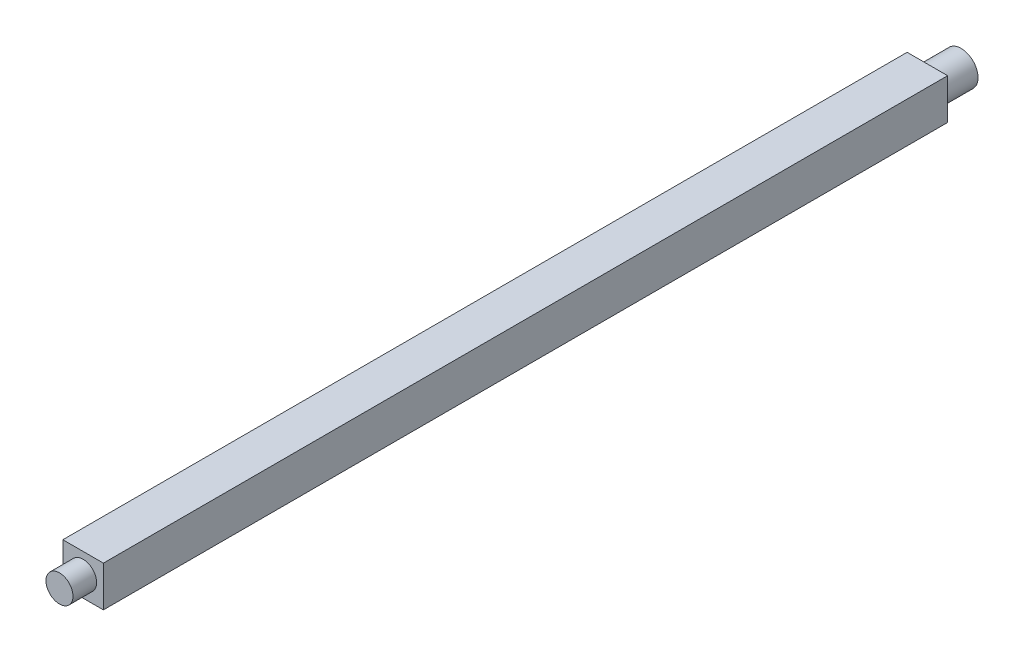
ISO-10303-21;
HEADER;
FILE_DESCRIPTION(('STEP AP214'),'2;1');
FILE_NAME('part.step','',(''),(''),'','','');
FILE_SCHEMA(('AUTOMOTIVE_DESIGN { 1 0 10303 214 1 1 1 1 }'));
ENDSEC;
DATA;
#1=APPLICATION_CONTEXT('core data for automotive mechanical design processes');
#2=APPLICATION_PROTOCOL_DEFINITION('international standard','automotive_design',2000,#1);
#3=PRODUCT_CONTEXT('',#1,'mechanical');
#4=PRODUCT('Part','Part','',(#3));
#5=PRODUCT_RELATED_PRODUCT_CATEGORY('part','',(#4));
#6=PRODUCT_DEFINITION_FORMATION('','',#4);
#7=PRODUCT_DEFINITION_CONTEXT('part definition',#1,'design');
#8=PRODUCT_DEFINITION('design','',#6,#7);
#9=PRODUCT_DEFINITION_SHAPE('','',#8);
#10=(LENGTH_UNIT() NAMED_UNIT(*) SI_UNIT(.MILLI.,.METRE.));
#11=(NAMED_UNIT(*) PLANE_ANGLE_UNIT() SI_UNIT($,.RADIAN.));
#12=(NAMED_UNIT(*) SI_UNIT($,.STERADIAN.) SOLID_ANGLE_UNIT());
#13=UNCERTAINTY_MEASURE_WITH_UNIT(LENGTH_MEASURE(1.E-05),#10,'distance_accuracy_value','');
#14=(GEOMETRIC_REPRESENTATION_CONTEXT(3) GLOBAL_UNCERTAINTY_ASSIGNED_CONTEXT((#13)) GLOBAL_UNIT_ASSIGNED_CONTEXT((#10,
#11,#12)) REPRESENTATION_CONTEXT('',''));
#15=CARTESIAN_POINT('',(0.,0.,0.));
#16=DIRECTION('',(0.,0.,1.));
#17=DIRECTION('',(1.,0.,0.));
#18=AXIS2_PLACEMENT_3D('',#15,#16,#17);
#19=CARTESIAN_POINT('',(0.,0.,250.));
#20=DIRECTION('',(0.,0.,1.));
#21=DIRECTION('',(1.,0.,0.));
#22=AXIS2_PLACEMENT_3D('',#19,#20,#21);
#23=PLANE('',#22);
#24=CARTESIAN_POINT('',(0.,0.,250.));
#25=DIRECTION('',(0.,0.,1.));
#26=DIRECTION('',(1.,0.,0.));
#27=AXIS2_PLACEMENT_3D('',#24,#25,#26);
#28=CIRCLE('',#27,4.);
#29=CARTESIAN_POINT('',(4.,0.,250.));
#30=VERTEX_POINT('',#29);
#31=EDGE_CURVE('E11',#30,#30,#28,.T.);
#32=ORIENTED_EDGE('',*,*,#31,.F.);
#33=EDGE_LOOP('',(#32));
#34=FACE_BOUND('',#33,.T.);
#35=DIRECTION('',(0.,1.,0.));
#36=VECTOR('',#35,1.);
#37=CARTESIAN_POINT('',(6.,6.,250.));
#38=LINE('',#37,#36);
#39=CARTESIAN_POINT('',(6.,-6.,250.));
#40=VERTEX_POINT('',#39);
#41=CARTESIAN_POINT('',(6.,6.,250.));
#42=VERTEX_POINT('',#41);
#43=EDGE_CURVE('E101',#40,#42,#38,.T.);
#44=ORIENTED_EDGE('',*,*,#43,.T.);
#45=DIRECTION('',(-1.,0.,0.));
#46=VECTOR('',#45,1.);
#47=CARTESIAN_POINT('',(-6.,6.,250.));
#48=LINE('',#47,#46);
#49=CARTESIAN_POINT('',(-6.,6.,250.));
#50=VERTEX_POINT('',#49);
#51=EDGE_CURVE('E104',#42,#50,#48,.T.);
#52=ORIENTED_EDGE('',*,*,#51,.T.);
#53=DIRECTION('',(0.,-1.,0.));
#54=VECTOR('',#53,1.);
#55=CARTESIAN_POINT('',(-6.,6.,250.));
#56=LINE('',#55,#54);
#57=CARTESIAN_POINT('',(-6.,-6.,250.));
#58=VERTEX_POINT('',#57);
#59=EDGE_CURVE('E85',#50,#58,#56,.T.);
#60=ORIENTED_EDGE('',*,*,#59,.T.);
#61=DIRECTION('',(1.,0.,0.));
#62=VECTOR('',#61,1.);
#63=CARTESIAN_POINT('',(-6.,-6.,250.));
#64=LINE('',#63,#62);
#65=EDGE_CURVE('E96',#58,#40,#64,.T.);
#66=ORIENTED_EDGE('',*,*,#65,.T.);
#67=EDGE_LOOP('',(#44,#52,#60,#66));
#68=FACE_BOUND('',#67,.T.);
#69=ADVANCED_FACE('F33',(#34,#68),#23,.T.);
#70=CARTESIAN_POINT('',(6.,6.,-1.66533453693773E-13));
#71=DIRECTION('',(1.,0.,0.));
#72=DIRECTION('',(0.,1.,0.));
#73=AXIS2_PLACEMENT_3D('',#70,#71,#72);
#74=PLANE('',#73);
#75=ORIENTED_EDGE('',*,*,#43,.F.);
#76=DIRECTION('',(0.,0.,1.));
#77=VECTOR('',#76,1.);
#78=CARTESIAN_POINT('',(6.,-6.,-1.66533453693773E-13));
#79=LINE('',#78,#77);
#80=CARTESIAN_POINT('',(6.,-6.,-1.66533453693773E-13));
#81=VERTEX_POINT('',#80);
#82=EDGE_CURVE('E49',#81,#40,#79,.T.);
#83=ORIENTED_EDGE('',*,*,#82,.F.);
#84=DIRECTION('',(0.,1.,0.));
#85=VECTOR('',#84,1.);
#86=CARTESIAN_POINT('',(6.,6.,-1.66533453693773E-13));
#87=LINE('',#86,#85);
#88=CARTESIAN_POINT('',(6.,6.,-1.66533453693773E-13));
#89=VERTEX_POINT('',#88);
#90=EDGE_CURVE('E94',#81,#89,#87,.T.);
#91=ORIENTED_EDGE('',*,*,#90,.T.);
#92=DIRECTION('',(0.,0.,1.));
#93=VECTOR('',#92,1.);
#94=CARTESIAN_POINT('',(6.,6.,-1.66533453693773E-13));
#95=LINE('',#94,#93);
#96=EDGE_CURVE('E77',#89,#42,#95,.T.);
#97=ORIENTED_EDGE('',*,*,#96,.T.);
#98=EDGE_LOOP('',(#75,#83,#91,#97));
#99=FACE_BOUND('',#98,.T.);
#100=ADVANCED_FACE('F133',(#99),#74,.T.);
#101=CARTESIAN_POINT('',(-6.,-6.,-1.66533453693773E-13));
#102=DIRECTION('',(0.,-1.,0.));
#103=DIRECTION('',(0.,0.,-1.));
#104=AXIS2_PLACEMENT_3D('',#101,#102,#103);
#105=PLANE('',#104);
#106=ORIENTED_EDGE('',*,*,#65,.F.);
#107=DIRECTION('',(0.,0.,1.));
#108=VECTOR('',#107,1.);
#109=CARTESIAN_POINT('',(-6.,-6.,-1.66533453693773E-13));
#110=LINE('',#109,#108);
#111=CARTESIAN_POINT('',(-6.,-6.,-1.66533453693773E-13));
#112=VERTEX_POINT('',#111);
#113=EDGE_CURVE('E66',#112,#58,#110,.T.);
#114=ORIENTED_EDGE('',*,*,#113,.F.);
#115=DIRECTION('',(1.,0.,0.));
#116=VECTOR('',#115,1.);
#117=CARTESIAN_POINT('',(-6.,-6.,-1.66533453693773E-13));
#118=LINE('',#117,#116);
#119=EDGE_CURVE('E91',#112,#81,#118,.T.);
#120=ORIENTED_EDGE('',*,*,#119,.T.);
#121=ORIENTED_EDGE('',*,*,#82,.T.);
#122=EDGE_LOOP('',(#106,#114,#120,#121));
#123=FACE_BOUND('',#122,.T.);
#124=ADVANCED_FACE('F138',(#123),#105,.T.);
#125=CARTESIAN_POINT('',(-6.,6.,-1.66533453693773E-13));
#126=DIRECTION('',(-1.,0.,0.));
#127=DIRECTION('',(0.,-1.,0.));
#128=AXIS2_PLACEMENT_3D('',#125,#126,#127);
#129=PLANE('',#128);
#130=ORIENTED_EDGE('',*,*,#59,.F.);
#131=DIRECTION('',(0.,0.,1.));
#132=VECTOR('',#131,1.);
#133=CARTESIAN_POINT('',(-6.,6.,-1.66533453693773E-13));
#134=LINE('',#133,#132);
#135=CARTESIAN_POINT('',(-6.,6.,-1.66533453693773E-13));
#136=VERTEX_POINT('',#135);
#137=EDGE_CURVE('E80',#136,#50,#134,.T.);
#138=ORIENTED_EDGE('',*,*,#137,.F.);
#139=DIRECTION('',(0.,-1.,0.));
#140=VECTOR('',#139,1.);
#141=CARTESIAN_POINT('',(-6.,6.,-1.66533453693773E-13));
#142=LINE('',#141,#140);
#143=EDGE_CURVE('E83',#136,#112,#142,.T.);
#144=ORIENTED_EDGE('',*,*,#143,.T.);
#145=ORIENTED_EDGE('',*,*,#113,.T.);
#146=EDGE_LOOP('',(#130,#138,#144,#145));
#147=FACE_BOUND('',#146,.T.);
#148=ADVANCED_FACE('F82',(#147),#129,.T.);
#149=CARTESIAN_POINT('',(-6.,6.,-1.66533453693773E-13));
#150=DIRECTION('',(0.,1.,0.));
#151=DIRECTION('',(0.,0.,1.));
#152=AXIS2_PLACEMENT_3D('',#149,#150,#151);
#153=PLANE('',#152);
#154=ORIENTED_EDGE('',*,*,#51,.F.);
#155=ORIENTED_EDGE('',*,*,#96,.F.);
#156=DIRECTION('',(-1.,0.,0.));
#157=VECTOR('',#156,1.);
#158=CARTESIAN_POINT('',(-6.,6.,-1.66533453693773E-13));
#159=LINE('',#158,#157);
#160=EDGE_CURVE('E90',#89,#136,#159,.T.);
#161=ORIENTED_EDGE('',*,*,#160,.T.);
#162=ORIENTED_EDGE('',*,*,#137,.T.);
#163=EDGE_LOOP('',(#154,#155,#161,#162));
#164=FACE_BOUND('',#163,.T.);
#165=ADVANCED_FACE('F93',(#164),#153,.T.);
#166=CARTESIAN_POINT('',(0.,0.,-1.66533453693773E-13));
#167=DIRECTION('',(0.,0.,1.));
#168=DIRECTION('',(1.,0.,0.));
#169=AXIS2_PLACEMENT_3D('',#166,#167,#168);
#170=PLANE('',#169);
#171=CARTESIAN_POINT('',(0.,0.,0.));
#172=DIRECTION('',(0.,0.,-1.));
#173=DIRECTION('',(-1.,0.,0.));
#174=AXIS2_PLACEMENT_3D('',#171,#172,#173);
#175=CIRCLE('',#174,5.);
#176=CARTESIAN_POINT('',(-5.,0.,0.));
#177=VERTEX_POINT('',#176);
#178=EDGE_CURVE('E111',#177,#177,#175,.T.);
#179=ORIENTED_EDGE('',*,*,#178,.F.);
#180=EDGE_LOOP('',(#179));
#181=FACE_BOUND('',#180,.T.);
#182=ORIENTED_EDGE('',*,*,#90,.F.);
#183=ORIENTED_EDGE('',*,*,#119,.F.);
#184=ORIENTED_EDGE('',*,*,#143,.F.);
#185=ORIENTED_EDGE('',*,*,#160,.F.);
#186=EDGE_LOOP('',(#182,#183,#184,#185));
#187=FACE_BOUND('',#186,.T.);
#188=ADVANCED_FACE('F89',(#181,#187),#170,.F.);
#189=CARTESIAN_POINT('',(0.,0.,-10.));
#190=DIRECTION('',(0.,0.,-1.));
#191=DIRECTION('',(-1.,0.,0.));
#192=AXIS2_PLACEMENT_3D('',#189,#190,#191);
#193=PLANE('',#192);
#194=CARTESIAN_POINT('',(0.,0.,-10.));
#195=DIRECTION('',(0.,0.,-1.));
#196=DIRECTION('',(-1.,0.,0.));
#197=AXIS2_PLACEMENT_3D('',#194,#195,#196);
#198=CIRCLE('',#197,5.);
#199=CARTESIAN_POINT('',(-5.,0.,-10.));
#200=VERTEX_POINT('',#199);
#201=EDGE_CURVE('E41',#200,#200,#198,.T.);
#202=ORIENTED_EDGE('',*,*,#201,.T.);
#203=EDGE_LOOP('',(#202));
#204=FACE_BOUND('',#203,.T.);
#205=ADVANCED_FACE('F121',(#204),#193,.T.);
#206=CARTESIAN_POINT('',(0.,0.,-10.));
#207=DIRECTION('',(0.,0.,1.));
#208=DIRECTION('',(1.,0.,0.));
#209=AXIS2_PLACEMENT_3D('',#206,#207,#208);
#210=CYLINDRICAL_SURFACE('',#209,5.);
#211=ORIENTED_EDGE('',*,*,#201,.F.);
#212=EDGE_LOOP('',(#211));
#213=FACE_BOUND('',#212,.T.);
#214=ORIENTED_EDGE('',*,*,#178,.T.);
#215=EDGE_LOOP('',(#214));
#216=FACE_BOUND('',#215,.T.);
#217=ADVANCED_FACE('F118',(#213,#216),#210,.T.);
#218=CARTESIAN_POINT('',(0.,0.,237.));
#219=DIRECTION('',(0.,0.,1.));
#220=DIRECTION('',(1.,0.,0.));
#221=AXIS2_PLACEMENT_3D('',#218,#219,#220);
#222=CYLINDRICAL_SURFACE('',#221,4.);
#223=ORIENTED_EDGE('',*,*,#31,.T.);
#224=EDGE_LOOP('',(#223));
#225=FACE_BOUND('',#224,.T.);
#226=CARTESIAN_POINT('',(0.,0.,257.));
#227=DIRECTION('',(0.,0.,1.));
#228=DIRECTION('',(1.,0.,0.));
#229=AXIS2_PLACEMENT_3D('',#226,#227,#228);
#230=CIRCLE('',#229,4.);
#231=CARTESIAN_POINT('',(4.,0.,257.));
#232=VERTEX_POINT('',#231);
#233=EDGE_CURVE('E105',#232,#232,#230,.T.);
#234=ORIENTED_EDGE('',*,*,#233,.F.);
#235=EDGE_LOOP('',(#234));
#236=FACE_BOUND('',#235,.T.);
#237=ADVANCED_FACE('F150',(#225,#236),#222,.T.);
#238=CARTESIAN_POINT('',(0.,0.,257.));
#239=DIRECTION('',(0.,0.,1.));
#240=DIRECTION('',(1.,0.,0.));
#241=AXIS2_PLACEMENT_3D('',#238,#239,#240);
#242=PLANE('',#241);
#243=ORIENTED_EDGE('',*,*,#233,.T.);
#244=EDGE_LOOP('',(#243));
#245=FACE_BOUND('',#244,.T.);
#246=ADVANCED_FACE('F148',(#245),#242,.T.);
#247=CLOSED_SHELL('',(#69,#100,#124,#148,#165,#188,#205,#217,#237,#246));
#248=MANIFOLD_SOLID_BREP('B2',#247);
#249=ADVANCED_BREP_SHAPE_REPRESENTATION('',(#18,#248),#14);
#250=SHAPE_DEFINITION_REPRESENTATION(#9,#249);
ENDSEC;
END-ISO-10303-21;
